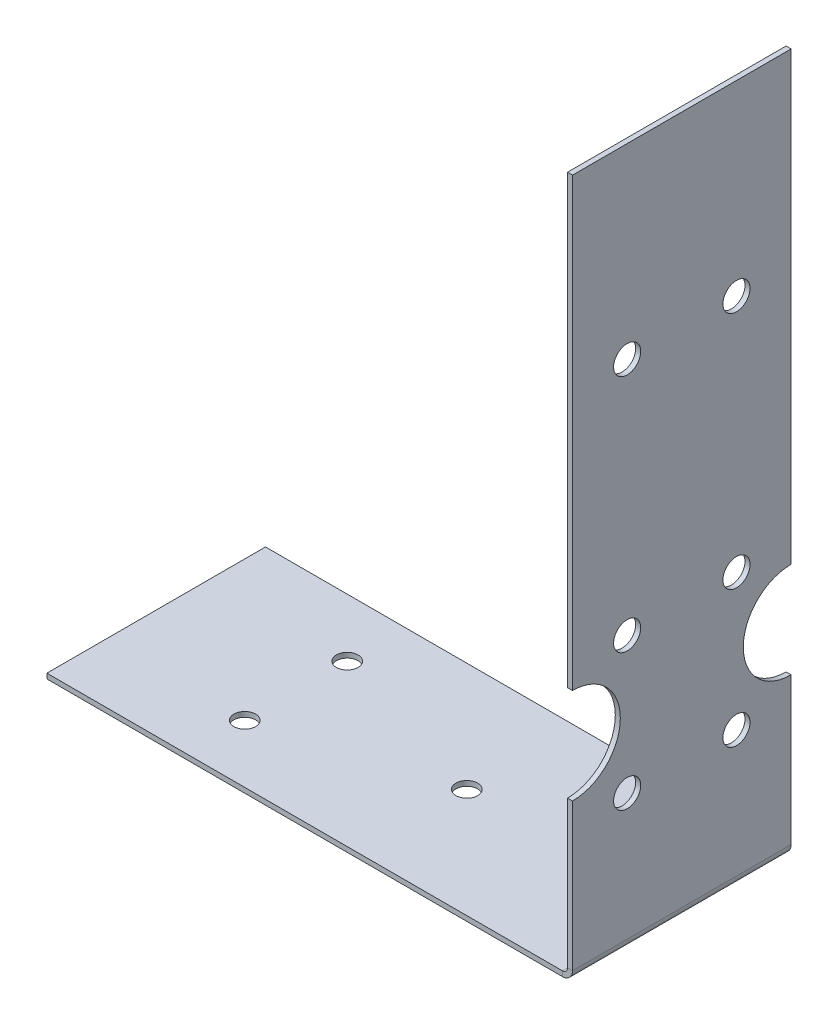
ISO-10303-21;
HEADER;
FILE_DESCRIPTION(('STEP AP214'),'2;1');
FILE_NAME('part.step','',(''),(''),'','','');
FILE_SCHEMA(('AUTOMOTIVE_DESIGN { 1 0 10303 214 1 1 1 1 }'));
ENDSEC;
DATA;
#1=APPLICATION_CONTEXT('core data for automotive mechanical design processes');
#2=APPLICATION_PROTOCOL_DEFINITION('international standard','automotive_design',2000,#1);
#3=PRODUCT_CONTEXT('',#1,'mechanical');
#4=PRODUCT('Part','Part','',(#3));
#5=PRODUCT_RELATED_PRODUCT_CATEGORY('part','',(#4));
#6=PRODUCT_DEFINITION_FORMATION('','',#4);
#7=PRODUCT_DEFINITION_CONTEXT('part definition',#1,'design');
#8=PRODUCT_DEFINITION('design','',#6,#7);
#9=PRODUCT_DEFINITION_SHAPE('','',#8);
#10=(LENGTH_UNIT() NAMED_UNIT(*) SI_UNIT(.MILLI.,.METRE.));
#11=(NAMED_UNIT(*) PLANE_ANGLE_UNIT() SI_UNIT($,.RADIAN.));
#12=(NAMED_UNIT(*) SI_UNIT($,.STERADIAN.) SOLID_ANGLE_UNIT());
#13=UNCERTAINTY_MEASURE_WITH_UNIT(LENGTH_MEASURE(1.E-05),#10,'distance_accuracy_value','');
#14=(GEOMETRIC_REPRESENTATION_CONTEXT(3) GLOBAL_UNCERTAINTY_ASSIGNED_CONTEXT((#13)) GLOBAL_UNIT_ASSIGNED_CONTEXT((#10,
#11,#12)) REPRESENTATION_CONTEXT('',''));
#15=CARTESIAN_POINT('',(0.,0.,0.));
#16=DIRECTION('',(0.,0.,1.));
#17=DIRECTION('',(1.,0.,0.));
#18=AXIS2_PLACEMENT_3D('',#15,#16,#17);
#19=CARTESIAN_POINT('',(-0.736600000000016,0.7366,-16.));
#20=DIRECTION('',(0.,0.,-1.));
#21=DIRECTION('',(-1.,0.,0.));
#22=AXIS2_PLACEMENT_3D('',#19,#20,#21);
#23=PLANE('',#22);
#24=DIRECTION('',(-1.,0.,0.));
#25=VECTOR('',#24,1.);
#26=CARTESIAN_POINT('',(10.,22.2634,-16.));
#27=LINE('',#26,#25);
#28=CARTESIAN_POINT('',(0.7366,22.2634,-16.));
#29=VERTEX_POINT('',#28);
#30=CARTESIAN_POINT('',(0.,22.2634,-16.));
#31=VERTEX_POINT('',#30);
#32=EDGE_CURVE('E11',#29,#31,#27,.T.);
#33=ORIENTED_EDGE('',*,*,#32,.F.);
#34=DIRECTION('',(0.,1.,0.));
#35=VECTOR('',#34,1.);
#36=CARTESIAN_POINT('',(0.7366,0.,-16.));
#37=LINE('',#36,#35);
#38=CARTESIAN_POINT('',(0.7366,0.7366,-16.));
#39=VERTEX_POINT('',#38);
#40=EDGE_CURVE('E282',#39,#29,#37,.T.);
#41=ORIENTED_EDGE('',*,*,#40,.F.);
#42=DIRECTION('',(-1.,0.,0.));
#43=VECTOR('',#42,1.);
#44=CARTESIAN_POINT('',(0.7366,0.7366,-16.));
#45=LINE('',#44,#43);
#46=CARTESIAN_POINT('',(0.,0.7366,-16.));
#47=VERTEX_POINT('',#46);
#48=EDGE_CURVE('E145',#39,#47,#45,.T.);
#49=ORIENTED_EDGE('',*,*,#48,.T.);
#50=DIRECTION('',(0.,1.,0.));
#51=VECTOR('',#50,1.);
#52=CARTESIAN_POINT('',(0.,0.,-16.));
#53=LINE('',#52,#51);
#54=EDGE_CURVE('E139',#47,#31,#53,.T.);
#55=ORIENTED_EDGE('',*,*,#54,.T.);
#56=EDGE_LOOP('',(#33,#41,#49,#55));
#57=FACE_BOUND('',#56,.T.);
#58=ADVANCED_FACE('F38',(#57),#23,.T.);
#59=CARTESIAN_POINT('',(-0.736600000000131,-0.7366,16.));
#60=DIRECTION('',(0.,0.,1.));
#61=DIRECTION('',(1.,0.,0.));
#62=AXIS2_PLACEMENT_3D('',#59,#60,#61);
#63=PLANE('',#62);
#64=DIRECTION('',(-1.,0.,0.));
#65=VECTOR('',#64,1.);
#66=CARTESIAN_POINT('',(10.,36.2634,16.));
#67=LINE('',#66,#65);
#68=CARTESIAN_POINT('',(0.7366,36.2634,16.));
#69=VERTEX_POINT('',#68);
#70=CARTESIAN_POINT('',(0.,36.2634,16.));
#71=VERTEX_POINT('',#70);
#72=EDGE_CURVE('E62',#69,#71,#67,.T.);
#73=ORIENTED_EDGE('',*,*,#72,.F.);
#74=DIRECTION('',(0.,1.,0.));
#75=VECTOR('',#74,1.);
#76=CARTESIAN_POINT('',(0.7366,0.,16.));
#77=LINE('',#76,#75);
#78=CARTESIAN_POINT('',(0.7366,101.6,16.));
#79=VERTEX_POINT('',#78);
#80=EDGE_CURVE('E166',#69,#79,#77,.T.);
#81=ORIENTED_EDGE('',*,*,#80,.T.);
#82=DIRECTION('',(1.,0.,0.));
#83=VECTOR('',#82,1.);
#84=CARTESIAN_POINT('',(0.,101.6,16.));
#85=LINE('',#84,#83);
#86=CARTESIAN_POINT('',(0.,101.6,16.));
#87=VERTEX_POINT('',#86);
#88=EDGE_CURVE('E262',#87,#79,#85,.T.);
#89=ORIENTED_EDGE('',*,*,#88,.F.);
#90=DIRECTION('',(0.,1.,0.));
#91=VECTOR('',#90,1.);
#92=CARTESIAN_POINT('',(0.,0.,16.));
#93=LINE('',#92,#91);
#94=EDGE_CURVE('E265',#71,#87,#93,.T.);
#95=ORIENTED_EDGE('',*,*,#94,.F.);
#96=EDGE_LOOP('',(#73,#81,#89,#95));
#97=FACE_BOUND('',#96,.T.);
#98=ADVANCED_FACE('F298',(#97),#63,.T.);
#99=CARTESIAN_POINT('',(0.,0.7366,16.));
#100=DIRECTION('',(0.,0.,1.));
#101=DIRECTION('',(1.,0.,0.));
#102=AXIS2_PLACEMENT_3D('',#99,#100,#101);
#103=PLANE('',#102);
#104=DIRECTION('',(1.,0.,0.));
#105=VECTOR('',#104,1.);
#106=CARTESIAN_POINT('',(0.,0.7366,16.));
#107=LINE('',#106,#105);
#108=CARTESIAN_POINT('',(0.,0.7366,16.));
#109=VERTEX_POINT('',#108);
#110=CARTESIAN_POINT('',(0.7366,0.7366,16.));
#111=VERTEX_POINT('',#110);
#112=EDGE_CURVE('E193',#109,#111,#107,.T.);
#113=ORIENTED_EDGE('',*,*,#112,.F.);
#114=CARTESIAN_POINT('',(-0.736600000000016,0.7366,16.));
#115=DIRECTION('',(0.,0.,-1.));
#116=DIRECTION('',(-1.,0.,0.));
#117=AXIS2_PLACEMENT_3D('',#114,#115,#116);
#118=CIRCLE('',#117,0.7366);
#119=CARTESIAN_POINT('',(-0.736600000000073,0.,16.));
#120=VERTEX_POINT('',#119);
#121=EDGE_CURVE('E269',#120,#109,#118,.F.);
#122=ORIENTED_EDGE('',*,*,#121,.F.);
#123=DIRECTION('',(0.,1.,0.));
#124=VECTOR('',#123,1.);
#125=CARTESIAN_POINT('',(-0.736600000000131,-0.7366,16.));
#126=LINE('',#125,#124);
#127=CARTESIAN_POINT('',(-0.736600000000131,-0.7366,16.));
#128=VERTEX_POINT('',#127);
#129=EDGE_CURVE('E191',#128,#120,#126,.T.);
#130=ORIENTED_EDGE('',*,*,#129,.F.);
#131=CARTESIAN_POINT('',(-0.736600000000016,0.7366,16.));
#132=DIRECTION('',(0.,0.,1.));
#133=DIRECTION('',(1.,0.,0.));
#134=AXIS2_PLACEMENT_3D('',#131,#132,#133);
#135=CIRCLE('',#134,1.4732);
#136=EDGE_CURVE('E171',#128,#111,#135,.T.);
#137=ORIENTED_EDGE('',*,*,#136,.T.);
#138=EDGE_LOOP('',(#113,#122,#130,#137));
#139=FACE_BOUND('',#138,.T.);
#140=ADVANCED_FACE('F40',(#139),#103,.T.);
#141=DIRECTION('',(-1.,0.,0.));
#142=VECTOR('',#141,1.);
#143=CARTESIAN_POINT('',(10.,22.2634,16.));
#144=LINE('',#143,#142);
#145=CARTESIAN_POINT('',(0.,22.2634,16.));
#146=VERTEX_POINT('',#145);
#147=CARTESIAN_POINT('',(0.7366,22.2634,16.));
#148=VERTEX_POINT('',#147);
#149=EDGE_CURVE('E255',#146,#148,#144,.F.);
#150=ORIENTED_EDGE('',*,*,#149,.F.);
#151=EDGE_CURVE('E266',#109,#146,#93,.T.);
#152=ORIENTED_EDGE('',*,*,#151,.F.);
#153=ORIENTED_EDGE('',*,*,#112,.T.);
#154=EDGE_CURVE('E259',#111,#148,#77,.T.);
#155=ORIENTED_EDGE('',*,*,#154,.T.);
#156=EDGE_LOOP('',(#150,#152,#153,#155));
#157=FACE_BOUND('',#156,.T.);
#158=ADVANCED_FACE('F302',(#157),#63,.T.);
#159=CARTESIAN_POINT('',(-0.736600000000073,0.,-16.));
#160=DIRECTION('',(0.,0.,-1.));
#161=DIRECTION('',(-1.,0.,0.));
#162=AXIS2_PLACEMENT_3D('',#159,#160,#161);
#163=PLANE('',#162);
#164=DIRECTION('',(0.,-1.,0.));
#165=VECTOR('',#164,1.);
#166=CARTESIAN_POINT('',(-0.736600000000073,0.,-16.));
#167=LINE('',#166,#165);
#168=CARTESIAN_POINT('',(-0.736600000000073,0.,-16.));
#169=VERTEX_POINT('',#168);
#170=CARTESIAN_POINT('',(-0.736600000000131,-0.7366,-16.));
#171=VERTEX_POINT('',#170);
#172=EDGE_CURVE('E189',#169,#171,#167,.T.);
#173=ORIENTED_EDGE('',*,*,#172,.F.);
#174=CARTESIAN_POINT('',(-0.736600000000016,0.7366,-16.));
#175=DIRECTION('',(0.,0.,-1.));
#176=DIRECTION('',(-1.,0.,0.));
#177=AXIS2_PLACEMENT_3D('',#174,#175,#176);
#178=CIRCLE('',#177,0.7366);
#179=EDGE_CURVE('E147',#169,#47,#178,.F.);
#180=ORIENTED_EDGE('',*,*,#179,.T.);
#181=ORIENTED_EDGE('',*,*,#48,.F.);
#182=CARTESIAN_POINT('',(-0.736600000000016,0.7366,-16.));
#183=DIRECTION('',(0.,0.,1.));
#184=DIRECTION('',(1.,0.,0.));
#185=AXIS2_PLACEMENT_3D('',#182,#183,#184);
#186=CIRCLE('',#185,1.4732);
#187=EDGE_CURVE('E163',#171,#39,#186,.T.);
#188=ORIENTED_EDGE('',*,*,#187,.F.);
#189=EDGE_LOOP('',(#173,#180,#181,#188));
#190=FACE_BOUND('',#189,.T.);
#191=ADVANCED_FACE('F313',(#190),#163,.T.);
#192=CARTESIAN_POINT('',(0.7366,0.7366,-16.));
#193=DIRECTION('',(0.,0.,-1.));
#194=DIRECTION('',(-1.,0.,0.));
#195=AXIS2_PLACEMENT_3D('',#192,#193,#194);
#196=PLANE('',#195);
#197=DIRECTION('',(1.,0.,0.));
#198=VECTOR('',#197,1.);
#199=CARTESIAN_POINT('',(-76.2,0.,-16.));
#200=LINE('',#199,#198);
#201=CARTESIAN_POINT('',(-76.2,0.,-16.));
#202=VERTEX_POINT('',#201);
#203=EDGE_CURVE('E149',#202,#169,#200,.T.);
#204=ORIENTED_EDGE('',*,*,#203,.T.);
#205=ORIENTED_EDGE('',*,*,#172,.T.);
#206=DIRECTION('',(1.,0.,0.));
#207=VECTOR('',#206,1.);
#208=CARTESIAN_POINT('',(-76.2,-0.7366,-16.));
#209=LINE('',#208,#207);
#210=CARTESIAN_POINT('',(-76.2,-0.7366,-16.));
#211=VERTEX_POINT('',#210);
#212=EDGE_CURVE('E160',#211,#171,#209,.T.);
#213=ORIENTED_EDGE('',*,*,#212,.F.);
#214=DIRECTION('',(0.,1.,0.));
#215=VECTOR('',#214,1.);
#216=CARTESIAN_POINT('',(-76.2,-0.7366,-16.));
#217=LINE('',#216,#215);
#218=EDGE_CURVE('E157',#211,#202,#217,.T.);
#219=ORIENTED_EDGE('',*,*,#218,.T.);
#220=EDGE_LOOP('',(#204,#205,#213,#219));
#221=FACE_BOUND('',#220,.T.);
#222=ADVANCED_FACE('F320',(#221),#196,.T.);
#223=CARTESIAN_POINT('',(0.7366,0.,16.));
#224=DIRECTION('',(-1.,0.,0.));
#225=DIRECTION('',(0.,0.,1.));
#226=AXIS2_PLACEMENT_3D('',#223,#224,#225);
#227=PLANE('',#226);
#228=CARTESIAN_POINT('',(0.7366,74.2634,-8.));
#229=DIRECTION('',(-1.,0.,0.));
#230=DIRECTION('',(0.,0.,1.));
#231=AXIS2_PLACEMENT_3D('',#228,#229,#230);
#232=CIRCLE('',#231,1.984375);
#233=CARTESIAN_POINT('',(0.7366,74.2634,-6.015625));
#234=VERTEX_POINT('',#233);
#235=EDGE_CURVE('E217',#234,#234,#232,.T.);
#236=ORIENTED_EDGE('',*,*,#235,.T.);
#237=EDGE_LOOP('',(#236));
#238=FACE_BOUND('',#237,.T.);
#239=CARTESIAN_POINT('',(0.7366,39.2634,-8.));
#240=DIRECTION('',(-1.,0.,0.));
#241=DIRECTION('',(0.,0.,1.));
#242=AXIS2_PLACEMENT_3D('',#239,#240,#241);
#243=CIRCLE('',#242,1.984375);
#244=CARTESIAN_POINT('',(0.7366,39.2634,-6.015625));
#245=VERTEX_POINT('',#244);
#246=EDGE_CURVE('E143',#245,#245,#243,.T.);
#247=ORIENTED_EDGE('',*,*,#246,.T.);
#248=EDGE_LOOP('',(#247));
#249=FACE_BOUND('',#248,.T.);
#250=CARTESIAN_POINT('',(0.7366,19.2634,-8.));
#251=DIRECTION('',(-1.,0.,0.));
#252=DIRECTION('',(0.,0.,1.));
#253=AXIS2_PLACEMENT_3D('',#250,#251,#252);
#254=CIRCLE('',#253,1.984375);
#255=CARTESIAN_POINT('',(0.7366,19.2634,-6.015625));
#256=VERTEX_POINT('',#255);
#257=EDGE_CURVE('E229',#256,#256,#254,.T.);
#258=ORIENTED_EDGE('',*,*,#257,.T.);
#259=EDGE_LOOP('',(#258));
#260=FACE_BOUND('',#259,.T.);
#261=CARTESIAN_POINT('',(0.7366,74.2634,8.));
#262=DIRECTION('',(-1.,0.,0.));
#263=DIRECTION('',(0.,0.,1.));
#264=AXIS2_PLACEMENT_3D('',#261,#262,#263);
#265=CIRCLE('',#264,1.984375);
#266=CARTESIAN_POINT('',(0.7366,74.2634,9.984375));
#267=VERTEX_POINT('',#266);
#268=EDGE_CURVE('E235',#267,#267,#265,.T.);
#269=ORIENTED_EDGE('',*,*,#268,.T.);
#270=EDGE_LOOP('',(#269));
#271=FACE_BOUND('',#270,.T.);
#272=CARTESIAN_POINT('',(0.7366,39.2634,8.));
#273=DIRECTION('',(-1.,0.,0.));
#274=DIRECTION('',(0.,0.,1.));
#275=AXIS2_PLACEMENT_3D('',#272,#273,#274);
#276=CIRCLE('',#275,1.984375);
#277=CARTESIAN_POINT('',(0.7366,39.2634,9.984375));
#278=VERTEX_POINT('',#277);
#279=EDGE_CURVE('E241',#278,#278,#276,.T.);
#280=ORIENTED_EDGE('',*,*,#279,.T.);
#281=EDGE_LOOP('',(#280));
#282=FACE_BOUND('',#281,.T.);
#283=CARTESIAN_POINT('',(0.7366,19.2634,8.));
#284=DIRECTION('',(-1.,0.,0.));
#285=DIRECTION('',(0.,0.,1.));
#286=AXIS2_PLACEMENT_3D('',#283,#284,#285);
#287=CIRCLE('',#286,1.984375);
#288=CARTESIAN_POINT('',(0.7366,19.2634,9.984375));
#289=VERTEX_POINT('',#288);
#290=EDGE_CURVE('E247',#289,#289,#287,.T.);
#291=ORIENTED_EDGE('',*,*,#290,.T.);
#292=EDGE_LOOP('',(#291));
#293=FACE_BOUND('',#292,.T.);
#294=ORIENTED_EDGE('',*,*,#40,.T.);
#295=CARTESIAN_POINT('',(0.7366,29.2634,-16.));
#296=DIRECTION('',(-1.,0.,0.));
#297=DIRECTION('',(0.,0.,1.));
#298=AXIS2_PLACEMENT_3D('',#295,#296,#297);
#299=CIRCLE('',#298,7.);
#300=CARTESIAN_POINT('',(0.7366,36.2634,-16.));
#301=VERTEX_POINT('',#300);
#302=EDGE_CURVE('E128',#29,#301,#299,.T.);
#303=ORIENTED_EDGE('',*,*,#302,.T.);
#304=CARTESIAN_POINT('',(0.7366,101.6,-16.));
#305=VERTEX_POINT('',#304);
#306=EDGE_CURVE('E258',#301,#305,#37,.T.);
#307=ORIENTED_EDGE('',*,*,#306,.T.);
#308=DIRECTION('',(0.,0.,-1.));
#309=VECTOR('',#308,1.);
#310=CARTESIAN_POINT('',(0.7366,101.6,16.));
#311=LINE('',#310,#309);
#312=EDGE_CURVE('E185',#79,#305,#311,.T.);
#313=ORIENTED_EDGE('',*,*,#312,.F.);
#314=ORIENTED_EDGE('',*,*,#80,.F.);
#315=CARTESIAN_POINT('',(0.7366,29.2634,16.));
#316=DIRECTION('',(-1.,0.,0.));
#317=DIRECTION('',(0.,0.,1.));
#318=AXIS2_PLACEMENT_3D('',#315,#316,#317);
#319=CIRCLE('',#318,7.);
#320=EDGE_CURVE('E252',#69,#148,#319,.T.);
#321=ORIENTED_EDGE('',*,*,#320,.T.);
#322=ORIENTED_EDGE('',*,*,#154,.F.);
#323=DIRECTION('',(0.,0.,-1.));
#324=VECTOR('',#323,1.);
#325=CARTESIAN_POINT('',(0.7366,0.7366,16.));
#326=LINE('',#325,#324);
#327=EDGE_CURVE('E167',#111,#39,#326,.T.);
#328=ORIENTED_EDGE('',*,*,#327,.T.);
#329=EDGE_LOOP('',(#294,#303,#307,#313,#314,#321,#322,#328));
#330=FACE_BOUND('',#329,.T.);
#331=ADVANCED_FACE('F287',(#238,#249,#260,#271,#282,#293,#330),#227,.F.);
#332=CARTESIAN_POINT('',(0.,101.6,16.));
#333=DIRECTION('',(0.,1.,0.));
#334=DIRECTION('',(0.,0.,1.));
#335=AXIS2_PLACEMENT_3D('',#332,#333,#334);
#336=PLANE('',#335);
#337=DIRECTION('',(1.,0.,0.));
#338=VECTOR('',#337,1.);
#339=CARTESIAN_POINT('',(0.,101.6,-16.));
#340=LINE('',#339,#338);
#341=CARTESIAN_POINT('',(0.,101.6,-16.));
#342=VERTEX_POINT('',#341);
#343=EDGE_CURVE('E151',#342,#305,#340,.T.);
#344=ORIENTED_EDGE('',*,*,#343,.F.);
#345=DIRECTION('',(0.,0.,-1.));
#346=VECTOR('',#345,1.);
#347=CARTESIAN_POINT('',(0.,101.6,16.));
#348=LINE('',#347,#346);
#349=EDGE_CURVE('E183',#87,#342,#348,.T.);
#350=ORIENTED_EDGE('',*,*,#349,.F.);
#351=ORIENTED_EDGE('',*,*,#88,.T.);
#352=ORIENTED_EDGE('',*,*,#312,.T.);
#353=EDGE_LOOP('',(#344,#350,#351,#352));
#354=FACE_BOUND('',#353,.T.);
#355=ADVANCED_FACE('F292',(#354),#336,.T.);
#356=CARTESIAN_POINT('',(0.,0.,16.));
#357=DIRECTION('',(-1.,0.,0.));
#358=DIRECTION('',(0.,0.,1.));
#359=AXIS2_PLACEMENT_3D('',#356,#357,#358);
#360=PLANE('',#359);
#361=CARTESIAN_POINT('',(0.,74.2634,-8.));
#362=DIRECTION('',(-1.,0.,0.));
#363=DIRECTION('',(0.,0.,-1.));
#364=AXIS2_PLACEMENT_3D('',#361,#362,#363);
#365=CIRCLE('',#364,1.984375);
#366=CARTESIAN_POINT('',(0.,74.2634,-9.984375));
#367=VERTEX_POINT('',#366);
#368=EDGE_CURVE('E198',#367,#367,#365,.T.);
#369=ORIENTED_EDGE('',*,*,#368,.F.);
#370=EDGE_LOOP('',(#369));
#371=FACE_BOUND('',#370,.T.);
#372=CARTESIAN_POINT('',(0.,39.2634,-8.));
#373=DIRECTION('',(-1.,0.,0.));
#374=DIRECTION('',(0.,0.,-1.));
#375=AXIS2_PLACEMENT_3D('',#372,#373,#374);
#376=CIRCLE('',#375,1.984375);
#377=CARTESIAN_POINT('',(0.,39.2634,-9.984375));
#378=VERTEX_POINT('',#377);
#379=EDGE_CURVE('E220',#378,#378,#376,.T.);
#380=ORIENTED_EDGE('',*,*,#379,.F.);
#381=EDGE_LOOP('',(#380));
#382=FACE_BOUND('',#381,.T.);
#383=CARTESIAN_POINT('',(0.,29.2634,-16.));
#384=DIRECTION('',(-1.,0.,0.));
#385=DIRECTION('',(0.,0.,-1.));
#386=AXIS2_PLACEMENT_3D('',#383,#384,#385);
#387=CIRCLE('',#386,7.);
#388=CARTESIAN_POINT('',(0.,36.2634,-16.));
#389=VERTEX_POINT('',#388);
#390=EDGE_CURVE('E54',#31,#389,#387,.T.);
#391=ORIENTED_EDGE('',*,*,#390,.F.);
#392=ORIENTED_EDGE('',*,*,#54,.F.);
#393=DIRECTION('',(0.,0.,-1.));
#394=VECTOR('',#393,1.);
#395=CARTESIAN_POINT('',(0.,0.7366,16.));
#396=LINE('',#395,#394);
#397=EDGE_CURVE('E181',#109,#47,#396,.T.);
#398=ORIENTED_EDGE('',*,*,#397,.F.);
#399=ORIENTED_EDGE('',*,*,#151,.T.);
#400=CARTESIAN_POINT('',(0.,29.2634,16.));
#401=DIRECTION('',(-1.,0.,0.));
#402=DIRECTION('',(0.,0.,1.));
#403=AXIS2_PLACEMENT_3D('',#400,#401,#402);
#404=CIRCLE('',#403,7.);
#405=EDGE_CURVE('E250',#71,#146,#404,.T.);
#406=ORIENTED_EDGE('',*,*,#405,.F.);
#407=ORIENTED_EDGE('',*,*,#94,.T.);
#408=ORIENTED_EDGE('',*,*,#349,.T.);
#409=EDGE_CURVE('E142',#389,#342,#53,.T.);
#410=ORIENTED_EDGE('',*,*,#409,.F.);
#411=EDGE_LOOP('',(#391,#392,#398,#399,#406,#407,#408,#410));
#412=FACE_BOUND('',#411,.T.);
#413=CARTESIAN_POINT('',(0.,19.2634,-8.));
#414=DIRECTION('',(-1.,0.,0.));
#415=DIRECTION('',(0.,0.,-1.));
#416=AXIS2_PLACEMENT_3D('',#413,#414,#415);
#417=CIRCLE('',#416,1.984375);
#418=CARTESIAN_POINT('',(0.,19.2634,-9.984375));
#419=VERTEX_POINT('',#418);
#420=EDGE_CURVE('E226',#419,#419,#417,.T.);
#421=ORIENTED_EDGE('',*,*,#420,.F.);
#422=EDGE_LOOP('',(#421));
#423=FACE_BOUND('',#422,.T.);
#424=CARTESIAN_POINT('',(0.,74.2634,8.));
#425=DIRECTION('',(-1.,0.,0.));
#426=DIRECTION('',(0.,0.,1.));
#427=AXIS2_PLACEMENT_3D('',#424,#425,#426);
#428=CIRCLE('',#427,1.984375);
#429=CARTESIAN_POINT('',(0.,74.2634,9.984375));
#430=VERTEX_POINT('',#429);
#431=EDGE_CURVE('E232',#430,#430,#428,.T.);
#432=ORIENTED_EDGE('',*,*,#431,.F.);
#433=EDGE_LOOP('',(#432));
#434=FACE_BOUND('',#433,.T.);
#435=CARTESIAN_POINT('',(0.,39.2634,8.));
#436=DIRECTION('',(-1.,0.,0.));
#437=DIRECTION('',(0.,0.,1.));
#438=AXIS2_PLACEMENT_3D('',#435,#436,#437);
#439=CIRCLE('',#438,1.984375);
#440=CARTESIAN_POINT('',(0.,39.2634,9.984375));
#441=VERTEX_POINT('',#440);
#442=EDGE_CURVE('E238',#441,#441,#439,.T.);
#443=ORIENTED_EDGE('',*,*,#442,.F.);
#444=EDGE_LOOP('',(#443));
#445=FACE_BOUND('',#444,.T.);
#446=CARTESIAN_POINT('',(0.,19.2634,8.));
#447=DIRECTION('',(-1.,0.,0.));
#448=DIRECTION('',(0.,0.,1.));
#449=AXIS2_PLACEMENT_3D('',#446,#447,#448);
#450=CIRCLE('',#449,1.984375);
#451=CARTESIAN_POINT('',(0.,19.2634,9.984375));
#452=VERTEX_POINT('',#451);
#453=EDGE_CURVE('E244',#452,#452,#450,.T.);
#454=ORIENTED_EDGE('',*,*,#453,.F.);
#455=EDGE_LOOP('',(#454));
#456=FACE_BOUND('',#455,.T.);
#457=ADVANCED_FACE('F136',(#371,#382,#412,#423,#434,#445,#456),#360,.T.);
#458=CARTESIAN_POINT('',(-0.736600000000016,0.7366,16.));
#459=DIRECTION('',(0.,0.,-1.));
#460=DIRECTION('',(-1.,0.,0.));
#461=AXIS2_PLACEMENT_3D('',#458,#459,#460);
#462=CYLINDRICAL_SURFACE('',#461,0.7366);
#463=ORIENTED_EDGE('',*,*,#179,.F.);
#464=DIRECTION('',(0.,0.,-1.));
#465=VECTOR('',#464,1.);
#466=CARTESIAN_POINT('',(-0.736600000000073,0.,16.));
#467=LINE('',#466,#465);
#468=EDGE_CURVE('E178',#120,#169,#467,.T.);
#469=ORIENTED_EDGE('',*,*,#468,.F.);
#470=ORIENTED_EDGE('',*,*,#121,.T.);
#471=ORIENTED_EDGE('',*,*,#397,.T.);
#472=EDGE_LOOP('',(#463,#469,#470,#471));
#473=FACE_BOUND('',#472,.T.);
#474=ADVANCED_FACE('F317',(#473),#462,.F.);
#475=CARTESIAN_POINT('',(-76.2,0.,16.));
#476=DIRECTION('',(0.,1.,0.));
#477=DIRECTION('',(0.,0.,1.));
#478=AXIS2_PLACEMENT_3D('',#475,#476,#477);
#479=PLANE('',#478);
#480=CARTESIAN_POINT('',(-55.7366000000001,0.,-7.5));
#481=DIRECTION('',(0.,1.,0.));
#482=DIRECTION('',(0.,0.,1.));
#483=AXIS2_PLACEMENT_3D('',#480,#481,#482);
#484=CIRCLE('',#483,1.5875);
#485=CARTESIAN_POINT('',(-55.7366000000001,0.,-5.9125));
#486=VERTEX_POINT('',#485);
#487=EDGE_CURVE('E212',#486,#486,#484,.T.);
#488=ORIENTED_EDGE('',*,*,#487,.F.);
#489=EDGE_LOOP('',(#488));
#490=FACE_BOUND('',#489,.T.);
#491=CARTESIAN_POINT('',(-55.7366000000001,0.,7.5));
#492=DIRECTION('',(0.,1.,0.));
#493=DIRECTION('',(0.,0.,1.));
#494=AXIS2_PLACEMENT_3D('',#491,#492,#493);
#495=CIRCLE('',#494,1.5875);
#496=CARTESIAN_POINT('',(-55.7366000000001,0.,9.0875));
#497=VERTEX_POINT('',#496);
#498=EDGE_CURVE('E202',#497,#497,#495,.T.);
#499=ORIENTED_EDGE('',*,*,#498,.F.);
#500=EDGE_LOOP('',(#499));
#501=FACE_BOUND('',#500,.T.);
#502=CARTESIAN_POINT('',(-30.7366000000001,0.,0.));
#503=DIRECTION('',(0.,1.,0.));
#504=DIRECTION('',(0.,0.,1.));
#505=AXIS2_PLACEMENT_3D('',#502,#503,#504);
#506=CIRCLE('',#505,1.5875);
#507=CARTESIAN_POINT('',(-30.7366000000001,0.,1.5875));
#508=VERTEX_POINT('',#507);
#509=EDGE_CURVE('E199',#508,#508,#506,.T.);
#510=ORIENTED_EDGE('',*,*,#509,.F.);
#511=EDGE_LOOP('',(#510));
#512=FACE_BOUND('',#511,.T.);
#513=ORIENTED_EDGE('',*,*,#203,.F.);
#514=DIRECTION('',(0.,0.,-1.));
#515=VECTOR('',#514,1.);
#516=CARTESIAN_POINT('',(-76.2,0.,16.));
#517=LINE('',#516,#515);
#518=CARTESIAN_POINT('',(-76.2,0.,16.));
#519=VERTEX_POINT('',#518);
#520=EDGE_CURVE('E176',#519,#202,#517,.T.);
#521=ORIENTED_EDGE('',*,*,#520,.F.);
#522=DIRECTION('',(1.,0.,0.));
#523=VECTOR('',#522,1.);
#524=CARTESIAN_POINT('',(-76.2,0.,16.));
#525=LINE('',#524,#523);
#526=EDGE_CURVE('E272',#519,#120,#525,.T.);
#527=ORIENTED_EDGE('',*,*,#526,.T.);
#528=ORIENTED_EDGE('',*,*,#468,.T.);
#529=EDGE_LOOP('',(#513,#521,#527,#528));
#530=FACE_BOUND('',#529,.T.);
#531=ADVANCED_FACE('F324',(#490,#501,#512,#530),#479,.T.);
#532=CARTESIAN_POINT('',(-76.2,-0.7366,16.));
#533=DIRECTION('',(-1.,0.,0.));
#534=DIRECTION('',(0.,0.,1.));
#535=AXIS2_PLACEMENT_3D('',#532,#533,#534);
#536=PLANE('',#535);
#537=ORIENTED_EDGE('',*,*,#218,.F.);
#538=DIRECTION('',(0.,0.,-1.));
#539=VECTOR('',#538,1.);
#540=CARTESIAN_POINT('',(-76.2,-0.7366,16.));
#541=LINE('',#540,#539);
#542=CARTESIAN_POINT('',(-76.2,-0.7366,16.));
#543=VERTEX_POINT('',#542);
#544=EDGE_CURVE('E174',#543,#211,#541,.T.);
#545=ORIENTED_EDGE('',*,*,#544,.F.);
#546=DIRECTION('',(0.,1.,0.));
#547=VECTOR('',#546,1.);
#548=CARTESIAN_POINT('',(-76.2,-0.7366,16.));
#549=LINE('',#548,#547);
#550=EDGE_CURVE('E275',#543,#519,#549,.T.);
#551=ORIENTED_EDGE('',*,*,#550,.T.);
#552=ORIENTED_EDGE('',*,*,#520,.T.);
#553=EDGE_LOOP('',(#537,#545,#551,#552));
#554=FACE_BOUND('',#553,.T.);
#555=ADVANCED_FACE('F330',(#554),#536,.T.);
#556=CARTESIAN_POINT('',(-76.2,-0.7366,16.));
#557=DIRECTION('',(0.,1.,0.));
#558=DIRECTION('',(0.,0.,1.));
#559=AXIS2_PLACEMENT_3D('',#556,#557,#558);
#560=PLANE('',#559);
#561=CARTESIAN_POINT('',(-55.7366000000001,-0.7366,-7.5));
#562=DIRECTION('',(0.,1.,0.));
#563=DIRECTION('',(0.,0.,1.));
#564=AXIS2_PLACEMENT_3D('',#561,#562,#563);
#565=CIRCLE('',#564,1.5875);
#566=CARTESIAN_POINT('',(-55.7366000000001,-0.7366,-5.9125));
#567=VERTEX_POINT('',#566);
#568=EDGE_CURVE('E42',#567,#567,#565,.T.);
#569=ORIENTED_EDGE('',*,*,#568,.T.);
#570=EDGE_LOOP('',(#569));
#571=FACE_BOUND('',#570,.T.);
#572=CARTESIAN_POINT('',(-55.7366000000001,-0.7366,7.5));
#573=DIRECTION('',(0.,1.,0.));
#574=DIRECTION('',(0.,0.,1.));
#575=AXIS2_PLACEMENT_3D('',#572,#573,#574);
#576=CIRCLE('',#575,1.5875);
#577=CARTESIAN_POINT('',(-55.7366000000001,-0.7366,9.0875));
#578=VERTEX_POINT('',#577);
#579=EDGE_CURVE('E200',#578,#578,#576,.T.);
#580=ORIENTED_EDGE('',*,*,#579,.T.);
#581=EDGE_LOOP('',(#580));
#582=FACE_BOUND('',#581,.T.);
#583=CARTESIAN_POINT('',(-30.7366000000001,-0.7366,0.));
#584=DIRECTION('',(0.,1.,0.));
#585=DIRECTION('',(0.,0.,1.));
#586=AXIS2_PLACEMENT_3D('',#583,#584,#585);
#587=CIRCLE('',#586,1.5875);
#588=CARTESIAN_POINT('',(-30.7366000000001,-0.7366,1.5875));
#589=VERTEX_POINT('',#588);
#590=EDGE_CURVE('E196',#589,#589,#587,.T.);
#591=ORIENTED_EDGE('',*,*,#590,.T.);
#592=EDGE_LOOP('',(#591));
#593=FACE_BOUND('',#592,.T.);
#594=ORIENTED_EDGE('',*,*,#212,.T.);
#595=DIRECTION('',(0.,0.,-1.));
#596=VECTOR('',#595,1.);
#597=CARTESIAN_POINT('',(-0.736600000000131,-0.7366,16.));
#598=LINE('',#597,#596);
#599=EDGE_CURVE('E170',#128,#171,#598,.T.);
#600=ORIENTED_EDGE('',*,*,#599,.F.);
#601=DIRECTION('',(1.,0.,0.));
#602=VECTOR('',#601,1.);
#603=CARTESIAN_POINT('',(-76.2,-0.7366,16.));
#604=LINE('',#603,#602);
#605=EDGE_CURVE('E278',#543,#128,#604,.T.);
#606=ORIENTED_EDGE('',*,*,#605,.F.);
#607=ORIENTED_EDGE('',*,*,#544,.T.);
#608=EDGE_LOOP('',(#594,#600,#606,#607));
#609=FACE_BOUND('',#608,.T.);
#610=ADVANCED_FACE('F333',(#571,#582,#593,#609),#560,.F.);
#611=CARTESIAN_POINT('',(-0.736600000000016,0.7366,16.));
#612=DIRECTION('',(0.,0.,-1.));
#613=DIRECTION('',(-1.,0.,0.));
#614=AXIS2_PLACEMENT_3D('',#611,#612,#613);
#615=CYLINDRICAL_SURFACE('',#614,1.4732);
#616=ORIENTED_EDGE('',*,*,#187,.T.);
#617=ORIENTED_EDGE('',*,*,#327,.F.);
#618=ORIENTED_EDGE('',*,*,#136,.F.);
#619=ORIENTED_EDGE('',*,*,#599,.T.);
#620=EDGE_LOOP('',(#616,#617,#618,#619));
#621=FACE_BOUND('',#620,.T.);
#622=ADVANCED_FACE('F309',(#621),#615,.T.);
#623=CARTESIAN_POINT('',(-0.736600000000016,0.7366,16.));
#624=DIRECTION('',(0.,0.,-1.));
#625=DIRECTION('',(-1.,0.,0.));
#626=AXIS2_PLACEMENT_3D('',#623,#624,#625);
#627=PLANE('',#626);
#628=ORIENTED_EDGE('',*,*,#605,.T.);
#629=ORIENTED_EDGE('',*,*,#129,.T.);
#630=ORIENTED_EDGE('',*,*,#526,.F.);
#631=ORIENTED_EDGE('',*,*,#550,.F.);
#632=EDGE_LOOP('',(#628,#629,#630,#631));
#633=FACE_BOUND('',#632,.T.);
#634=ADVANCED_FACE('F328',(#633),#627,.F.);
#635=DIRECTION('',(-1.,0.,0.));
#636=VECTOR('',#635,1.);
#637=CARTESIAN_POINT('',(10.,36.2634,-16.));
#638=LINE('',#637,#636);
#639=EDGE_CURVE('E47',#389,#301,#638,.F.);
#640=ORIENTED_EDGE('',*,*,#639,.F.);
#641=ORIENTED_EDGE('',*,*,#409,.T.);
#642=ORIENTED_EDGE('',*,*,#343,.T.);
#643=ORIENTED_EDGE('',*,*,#306,.F.);
#644=EDGE_LOOP('',(#640,#641,#642,#643));
#645=FACE_BOUND('',#644,.T.);
#646=ADVANCED_FACE('F295',(#645),#23,.T.);
#647=CARTESIAN_POINT('',(10.,29.2634,16.));
#648=DIRECTION('',(-1.,0.,0.));
#649=DIRECTION('',(0.,0.,1.));
#650=AXIS2_PLACEMENT_3D('',#647,#648,#649);
#651=CYLINDRICAL_SURFACE('',#650,7.);
#652=ORIENTED_EDGE('',*,*,#72,.T.);
#653=ORIENTED_EDGE('',*,*,#405,.T.);
#654=ORIENTED_EDGE('',*,*,#149,.T.);
#655=ORIENTED_EDGE('',*,*,#320,.F.);
#656=EDGE_LOOP('',(#652,#653,#654,#655));
#657=FACE_BOUND('',#656,.T.);
#658=ADVANCED_FACE('F350',(#657),#651,.F.);
#659=CARTESIAN_POINT('',(10.,19.2634,8.));
#660=DIRECTION('',(-1.,0.,0.));
#661=DIRECTION('',(0.,0.,1.));
#662=AXIS2_PLACEMENT_3D('',#659,#660,#661);
#663=CYLINDRICAL_SURFACE('',#662,1.984375);
#664=ORIENTED_EDGE('',*,*,#453,.T.);
#665=EDGE_LOOP('',(#664));
#666=FACE_BOUND('',#665,.T.);
#667=ORIENTED_EDGE('',*,*,#290,.F.);
#668=EDGE_LOOP('',(#667));
#669=FACE_BOUND('',#668,.T.);
#670=ADVANCED_FACE('F355',(#666,#669),#663,.F.);
#671=CARTESIAN_POINT('',(10.,39.2634,8.));
#672=DIRECTION('',(-1.,0.,0.));
#673=DIRECTION('',(0.,0.,1.));
#674=AXIS2_PLACEMENT_3D('',#671,#672,#673);
#675=CYLINDRICAL_SURFACE('',#674,1.984375);
#676=ORIENTED_EDGE('',*,*,#442,.T.);
#677=EDGE_LOOP('',(#676));
#678=FACE_BOUND('',#677,.T.);
#679=ORIENTED_EDGE('',*,*,#279,.F.);
#680=EDGE_LOOP('',(#679));
#681=FACE_BOUND('',#680,.T.);
#682=ADVANCED_FACE('F362',(#678,#681),#675,.F.);
#683=CARTESIAN_POINT('',(10.,74.2634,8.));
#684=DIRECTION('',(-1.,0.,0.));
#685=DIRECTION('',(0.,0.,1.));
#686=AXIS2_PLACEMENT_3D('',#683,#684,#685);
#687=CYLINDRICAL_SURFACE('',#686,1.984375);
#688=ORIENTED_EDGE('',*,*,#431,.T.);
#689=EDGE_LOOP('',(#688));
#690=FACE_BOUND('',#689,.T.);
#691=ORIENTED_EDGE('',*,*,#268,.F.);
#692=EDGE_LOOP('',(#691));
#693=FACE_BOUND('',#692,.T.);
#694=ADVANCED_FACE('F366',(#690,#693),#687,.F.);
#695=CARTESIAN_POINT('',(10.,19.2634,-8.));
#696=DIRECTION('',(-1.,0.,0.));
#697=DIRECTION('',(0.,0.,1.));
#698=AXIS2_PLACEMENT_3D('',#695,#696,#697);
#699=CYLINDRICAL_SURFACE('',#698,1.984375);
#700=ORIENTED_EDGE('',*,*,#420,.T.);
#701=EDGE_LOOP('',(#700));
#702=FACE_BOUND('',#701,.T.);
#703=ORIENTED_EDGE('',*,*,#257,.F.);
#704=EDGE_LOOP('',(#703));
#705=FACE_BOUND('',#704,.T.);
#706=ADVANCED_FACE('F370',(#702,#705),#699,.F.);
#707=CARTESIAN_POINT('',(10.,29.2634,-16.));
#708=DIRECTION('',(-1.,0.,0.));
#709=DIRECTION('',(0.,0.,1.));
#710=AXIS2_PLACEMENT_3D('',#707,#708,#709);
#711=CYLINDRICAL_SURFACE('',#710,7.);
#712=ORIENTED_EDGE('',*,*,#32,.T.);
#713=ORIENTED_EDGE('',*,*,#390,.T.);
#714=ORIENTED_EDGE('',*,*,#639,.T.);
#715=ORIENTED_EDGE('',*,*,#302,.F.);
#716=EDGE_LOOP('',(#712,#713,#714,#715));
#717=FACE_BOUND('',#716,.T.);
#718=ADVANCED_FACE('F126',(#717),#711,.F.);
#719=CARTESIAN_POINT('',(10.,39.2634,-8.));
#720=DIRECTION('',(-1.,0.,0.));
#721=DIRECTION('',(0.,0.,1.));
#722=AXIS2_PLACEMENT_3D('',#719,#720,#721);
#723=CYLINDRICAL_SURFACE('',#722,1.984375);
#724=ORIENTED_EDGE('',*,*,#379,.T.);
#725=EDGE_LOOP('',(#724));
#726=FACE_BOUND('',#725,.T.);
#727=ORIENTED_EDGE('',*,*,#246,.F.);
#728=EDGE_LOOP('',(#727));
#729=FACE_BOUND('',#728,.T.);
#730=ADVANCED_FACE('F377',(#726,#729),#723,.F.);
#731=CARTESIAN_POINT('',(10.,74.2634,-8.));
#732=DIRECTION('',(-1.,0.,0.));
#733=DIRECTION('',(0.,0.,1.));
#734=AXIS2_PLACEMENT_3D('',#731,#732,#733);
#735=CYLINDRICAL_SURFACE('',#734,1.984375);
#736=ORIENTED_EDGE('',*,*,#368,.T.);
#737=EDGE_LOOP('',(#736));
#738=FACE_BOUND('',#737,.T.);
#739=ORIENTED_EDGE('',*,*,#235,.F.);
#740=EDGE_LOOP('',(#739));
#741=FACE_BOUND('',#740,.T.);
#742=ADVANCED_FACE('F380',(#738,#741),#735,.F.);
#743=CARTESIAN_POINT('',(-30.7366000000001,-10.,0.));
#744=DIRECTION('',(0.,1.,0.));
#745=DIRECTION('',(0.,0.,1.));
#746=AXIS2_PLACEMENT_3D('',#743,#744,#745);
#747=CYLINDRICAL_SURFACE('',#746,1.5875);
#748=ORIENTED_EDGE('',*,*,#509,.T.);
#749=EDGE_LOOP('',(#748));
#750=FACE_BOUND('',#749,.T.);
#751=ORIENTED_EDGE('',*,*,#590,.F.);
#752=EDGE_LOOP('',(#751));
#753=FACE_BOUND('',#752,.T.);
#754=ADVANCED_FACE('F384',(#750,#753),#747,.F.);
#755=CARTESIAN_POINT('',(-55.7366000000001,-10.,7.5));
#756=DIRECTION('',(0.,1.,0.));
#757=DIRECTION('',(0.,0.,1.));
#758=AXIS2_PLACEMENT_3D('',#755,#756,#757);
#759=CYLINDRICAL_SURFACE('',#758,1.5875);
#760=ORIENTED_EDGE('',*,*,#498,.T.);
#761=EDGE_LOOP('',(#760));
#762=FACE_BOUND('',#761,.T.);
#763=ORIENTED_EDGE('',*,*,#579,.F.);
#764=EDGE_LOOP('',(#763));
#765=FACE_BOUND('',#764,.T.);
#766=ADVANCED_FACE('F388',(#762,#765),#759,.F.);
#767=CARTESIAN_POINT('',(-55.7366000000001,-10.,-7.5));
#768=DIRECTION('',(0.,1.,0.));
#769=DIRECTION('',(0.,0.,1.));
#770=AXIS2_PLACEMENT_3D('',#767,#768,#769);
#771=CYLINDRICAL_SURFACE('',#770,1.5875);
#772=ORIENTED_EDGE('',*,*,#487,.T.);
#773=EDGE_LOOP('',(#772));
#774=FACE_BOUND('',#773,.T.);
#775=ORIENTED_EDGE('',*,*,#568,.F.);
#776=EDGE_LOOP('',(#775));
#777=FACE_BOUND('',#776,.T.);
#778=ADVANCED_FACE('F392',(#774,#777),#771,.F.);
#779=CLOSED_SHELL('',(#58,#98,#140,#158,#191,#222,#331,#355,#457,#474,#531,#555,#610,#622,#634,
#646,#658,#670,#682,#694,#706,#718,#730,#742,#754,#766,#778));
#780=MANIFOLD_SOLID_BREP('B2',#779);
#781=ADVANCED_BREP_SHAPE_REPRESENTATION('',(#18,#780),#14);
#782=SHAPE_DEFINITION_REPRESENTATION(#9,#781);
ENDSEC;
END-ISO-10303-21;
